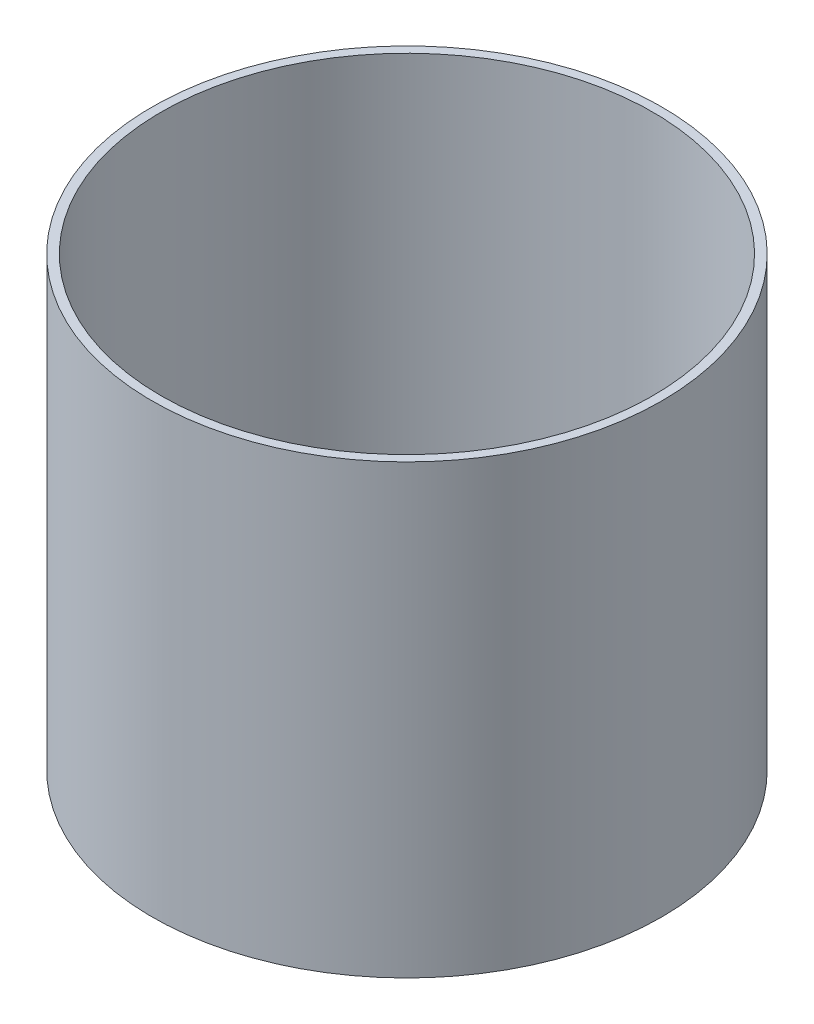
ISO-10303-21;
HEADER;
FILE_DESCRIPTION(('STEP AP214'),'2;1');
FILE_NAME('part.step','',(''),(''),'','','');
FILE_SCHEMA(('AUTOMOTIVE_DESIGN { 1 0 10303 214 1 1 1 1 }'));
ENDSEC;
DATA;
#1=APPLICATION_CONTEXT('core data for automotive mechanical design processes');
#2=APPLICATION_PROTOCOL_DEFINITION('international standard','automotive_design',2000,#1);
#3=PRODUCT_CONTEXT('',#1,'mechanical');
#4=PRODUCT('Part','Part','',(#3));
#5=PRODUCT_RELATED_PRODUCT_CATEGORY('part','',(#4));
#6=PRODUCT_DEFINITION_FORMATION('','',#4);
#7=PRODUCT_DEFINITION_CONTEXT('part definition',#1,'design');
#8=PRODUCT_DEFINITION('design','',#6,#7);
#9=PRODUCT_DEFINITION_SHAPE('','',#8);
#10=(LENGTH_UNIT() NAMED_UNIT(*) SI_UNIT(.MILLI.,.METRE.));
#11=(NAMED_UNIT(*) PLANE_ANGLE_UNIT() SI_UNIT($,.RADIAN.));
#12=(NAMED_UNIT(*) SI_UNIT($,.STERADIAN.) SOLID_ANGLE_UNIT());
#13=UNCERTAINTY_MEASURE_WITH_UNIT(LENGTH_MEASURE(1.E-05),#10,'distance_accuracy_value','');
#14=(GEOMETRIC_REPRESENTATION_CONTEXT(3) GLOBAL_UNCERTAINTY_ASSIGNED_CONTEXT((#13)) GLOBAL_UNIT_ASSIGNED_CONTEXT((#10,
#11,#12)) REPRESENTATION_CONTEXT('',''));
#15=CARTESIAN_POINT('',(0.,0.,0.));
#16=DIRECTION('',(0.,0.,1.));
#17=DIRECTION('',(1.,0.,0.));
#18=AXIS2_PLACEMENT_3D('',#15,#16,#17);
#19=CARTESIAN_POINT('',(0.,10.,0.));
#20=DIRECTION('',(0.,1.,0.));
#21=DIRECTION('',(0.,0.,1.));
#22=AXIS2_PLACEMENT_3D('',#19,#20,#21);
#23=PLANE('',#22);
#24=CARTESIAN_POINT('',(0.,10.,0.));
#25=DIRECTION('',(0.,1.,0.));
#26=DIRECTION('',(1.,0.,0.));
#27=AXIS2_PLACEMENT_3D('',#24,#25,#26);
#28=CIRCLE('',#27,5.7);
#29=CARTESIAN_POINT('',(5.7,10.,0.));
#30=VERTEX_POINT('',#29);
#31=EDGE_CURVE('E11',#30,#30,#28,.T.);
#32=ORIENTED_EDGE('',*,*,#31,.T.);
#33=EDGE_LOOP('',(#32));
#34=FACE_BOUND('',#33,.T.);
#35=CARTESIAN_POINT('',(0.,10.,0.));
#36=DIRECTION('',(0.,1.,0.));
#37=DIRECTION('',(0.,0.,1.));
#38=AXIS2_PLACEMENT_3D('',#35,#36,#37);
#39=CIRCLE('',#38,5.5);
#40=CARTESIAN_POINT('',(0.,10.,5.5));
#41=VERTEX_POINT('',#40);
#42=EDGE_CURVE('E52',#41,#41,#39,.T.);
#43=ORIENTED_EDGE('',*,*,#42,.F.);
#44=EDGE_LOOP('',(#43));
#45=FACE_BOUND('',#44,.T.);
#46=ADVANCED_FACE('F41',(#34,#45),#23,.T.);
#47=CARTESIAN_POINT('',(0.,0.,0.));
#48=DIRECTION('',(0.,1.,0.));
#49=DIRECTION('',(0.,0.,1.));
#50=AXIS2_PLACEMENT_3D('',#47,#48,#49);
#51=PLANE('',#50);
#52=CARTESIAN_POINT('',(0.,0.,0.));
#53=DIRECTION('',(0.,1.,0.));
#54=DIRECTION('',(1.,0.,0.));
#55=AXIS2_PLACEMENT_3D('',#52,#53,#54);
#56=CIRCLE('',#55,5.7);
#57=CARTESIAN_POINT('',(5.7,0.,0.));
#58=VERTEX_POINT('',#57);
#59=EDGE_CURVE('E45',#58,#58,#56,.T.);
#60=ORIENTED_EDGE('',*,*,#59,.F.);
#61=EDGE_LOOP('',(#60));
#62=FACE_BOUND('',#61,.T.);
#63=CARTESIAN_POINT('',(0.,0.,0.));
#64=DIRECTION('',(0.,1.,0.));
#65=DIRECTION('',(0.,0.,1.));
#66=AXIS2_PLACEMENT_3D('',#63,#64,#65);
#67=CIRCLE('',#66,5.5);
#68=CARTESIAN_POINT('',(0.,0.,5.5));
#69=VERTEX_POINT('',#68);
#70=EDGE_CURVE('E54',#69,#69,#67,.T.);
#71=ORIENTED_EDGE('',*,*,#70,.T.);
#72=EDGE_LOOP('',(#71));
#73=FACE_BOUND('',#72,.T.);
#74=ADVANCED_FACE('F64',(#62,#73),#51,.F.);
#75=CARTESIAN_POINT('',(0.,10.,0.));
#76=DIRECTION('',(0.,-1.,0.));
#77=DIRECTION('',(0.,0.,-1.));
#78=AXIS2_PLACEMENT_3D('',#75,#76,#77);
#79=CYLINDRICAL_SURFACE('',#78,5.7);
#80=ORIENTED_EDGE('',*,*,#31,.F.);
#81=EDGE_LOOP('',(#80));
#82=FACE_BOUND('',#81,.T.);
#83=ORIENTED_EDGE('',*,*,#59,.T.);
#84=EDGE_LOOP('',(#83));
#85=FACE_BOUND('',#84,.T.);
#86=ADVANCED_FACE('F43',(#82,#85),#79,.T.);
#87=CARTESIAN_POINT('',(0.,10.,0.));
#88=DIRECTION('',(0.,-1.,0.));
#89=DIRECTION('',(0.,0.,-1.));
#90=AXIS2_PLACEMENT_3D('',#87,#88,#89);
#91=CYLINDRICAL_SURFACE('',#90,5.5);
#92=ORIENTED_EDGE('',*,*,#42,.T.);
#93=EDGE_LOOP('',(#92));
#94=FACE_BOUND('',#93,.T.);
#95=ORIENTED_EDGE('',*,*,#70,.F.);
#96=EDGE_LOOP('',(#95));
#97=FACE_BOUND('',#96,.T.);
#98=ADVANCED_FACE('F60',(#94,#97),#91,.F.);
#99=CLOSED_SHELL('',(#46,#74,#86,#98));
#100=MANIFOLD_SOLID_BREP('B2',#99);
#101=ADVANCED_BREP_SHAPE_REPRESENTATION('',(#18,#100),#14);
#102=SHAPE_DEFINITION_REPRESENTATION(#9,#101);
ENDSEC;
END-ISO-10303-21;
